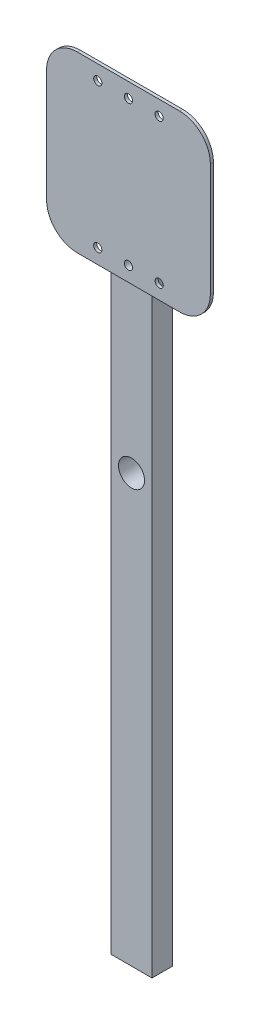
ISO-10303-21;
HEADER;
FILE_DESCRIPTION(('STEP AP214'),'2;1');
FILE_NAME('part.step','',(''),(''),'','','');
FILE_SCHEMA(('AUTOMOTIVE_DESIGN { 1 0 10303 214 1 1 1 1 }'));
ENDSEC;
DATA;
#1=APPLICATION_CONTEXT('core data for automotive mechanical design processes');
#2=APPLICATION_PROTOCOL_DEFINITION('international standard','automotive_design',2000,#1);
#3=PRODUCT_CONTEXT('',#1,'mechanical');
#4=PRODUCT('Part','Part','',(#3));
#5=PRODUCT_RELATED_PRODUCT_CATEGORY('part','',(#4));
#6=PRODUCT_DEFINITION_FORMATION('','',#4);
#7=PRODUCT_DEFINITION_CONTEXT('part definition',#1,'design');
#8=PRODUCT_DEFINITION('design','',#6,#7);
#9=PRODUCT_DEFINITION_SHAPE('','',#8);
#10=(LENGTH_UNIT() NAMED_UNIT(*) SI_UNIT(.MILLI.,.METRE.));
#11=(NAMED_UNIT(*) PLANE_ANGLE_UNIT() SI_UNIT($,.RADIAN.));
#12=(NAMED_UNIT(*) SI_UNIT($,.STERADIAN.) SOLID_ANGLE_UNIT());
#13=UNCERTAINTY_MEASURE_WITH_UNIT(LENGTH_MEASURE(1.E-05),#10,'distance_accuracy_value','');
#14=(GEOMETRIC_REPRESENTATION_CONTEXT(3) GLOBAL_UNCERTAINTY_ASSIGNED_CONTEXT((#13)) GLOBAL_UNIT_ASSIGNED_CONTEXT((#10,
#11,#12)) REPRESENTATION_CONTEXT('',''));
#15=CARTESIAN_POINT('',(0.,0.,0.));
#16=DIRECTION('',(0.,0.,1.));
#17=DIRECTION('',(1.,0.,0.));
#18=AXIS2_PLACEMENT_3D('',#15,#16,#17);
#19=CARTESIAN_POINT('',(-50.,-55.0000000000001,3.));
#20=DIRECTION('',(0.,0.,1.));
#21=DIRECTION('',(1.,0.,0.));
#22=AXIS2_PLACEMENT_3D('',#19,#20,#21);
#23=PLANE('',#22);
#24=CARTESIAN_POINT('',(-30.,-70.6,3.));
#25=DIRECTION('',(0.,0.,1.));
#26=DIRECTION('',(1.,0.,0.));
#27=AXIS2_PLACEMENT_3D('',#24,#25,#26);
#28=CIRCLE('',#27,4.);
#29=CARTESIAN_POINT('',(-26.,-70.6,3.));
#30=VERTEX_POINT('',#29);
#31=EDGE_CURVE('E226',#30,#30,#28,.T.);
#32=ORIENTED_EDGE('',*,*,#31,.F.);
#33=EDGE_LOOP('',(#32));
#34=FACE_BOUND('',#33,.T.);
#35=CARTESIAN_POINT('',(-30.,70.6,3.));
#36=DIRECTION('',(0.,0.,1.));
#37=DIRECTION('',(1.,0.,0.));
#38=AXIS2_PLACEMENT_3D('',#35,#36,#37);
#39=CIRCLE('',#38,4.);
#40=CARTESIAN_POINT('',(-26.,70.6,3.));
#41=VERTEX_POINT('',#40);
#42=EDGE_CURVE('E238',#41,#41,#39,.T.);
#43=ORIENTED_EDGE('',*,*,#42,.F.);
#44=EDGE_LOOP('',(#43));
#45=FACE_BOUND('',#44,.T.);
#46=CARTESIAN_POINT('',(0.,70.6,3.));
#47=DIRECTION('',(0.,0.,1.));
#48=DIRECTION('',(1.,0.,0.));
#49=AXIS2_PLACEMENT_3D('',#46,#47,#48);
#50=CIRCLE('',#49,4.);
#51=CARTESIAN_POINT('',(4.,70.6,3.));
#52=VERTEX_POINT('',#51);
#53=EDGE_CURVE('E150',#52,#52,#50,.T.);
#54=ORIENTED_EDGE('',*,*,#53,.F.);
#55=EDGE_LOOP('',(#54));
#56=FACE_BOUND('',#55,.T.);
#57=CARTESIAN_POINT('',(-50.,-55.0000000000001,3.));
#58=DIRECTION('',(0.,0.,1.));
#59=DIRECTION('',(1.,0.,0.));
#60=AXIS2_PLACEMENT_3D('',#57,#58,#59);
#61=CIRCLE('',#60,30.);
#62=CARTESIAN_POINT('',(-80.,-54.9999999999999,3.));
#63=VERTEX_POINT('',#62);
#64=CARTESIAN_POINT('',(-49.9999999999999,-85.0000000000001,3.));
#65=VERTEX_POINT('',#64);
#66=EDGE_CURVE('E165',#63,#65,#61,.T.);
#67=ORIENTED_EDGE('',*,*,#66,.T.);
#68=DIRECTION('',(1.,0.,0.));
#69=VECTOR('',#68,1.);
#70=CARTESIAN_POINT('',(49.9999999999994,-85.0000000000003,3.));
#71=LINE('',#70,#69);
#72=CARTESIAN_POINT('',(49.9999999999994,-85.0000000000003,3.));
#73=VERTEX_POINT('',#72);
#74=EDGE_CURVE('E103',#65,#73,#71,.T.);
#75=ORIENTED_EDGE('',*,*,#74,.T.);
#76=CARTESIAN_POINT('',(49.9999999999997,-55.0000000000003,3.));
#77=DIRECTION('',(0.,0.,1.));
#78=DIRECTION('',(1.,0.,0.));
#79=AXIS2_PLACEMENT_3D('',#76,#77,#78);
#80=CIRCLE('',#79,30.);
#81=CARTESIAN_POINT('',(79.9999999999997,-55.0000000000001,3.));
#82=VERTEX_POINT('',#81);
#83=EDGE_CURVE('E253',#73,#82,#80,.T.);
#84=ORIENTED_EDGE('',*,*,#83,.T.);
#85=DIRECTION('',(0.,1.,0.));
#86=VECTOR('',#85,1.);
#87=CARTESIAN_POINT('',(79.9999999999999,54.9999999999997,3.));
#88=LINE('',#87,#86);
#89=CARTESIAN_POINT('',(79.9999999999999,54.9999999999997,3.));
#90=VERTEX_POINT('',#89);
#91=EDGE_CURVE('E255',#82,#90,#88,.T.);
#92=ORIENTED_EDGE('',*,*,#91,.T.);
#93=CARTESIAN_POINT('',(49.9999999999999,55.,3.));
#94=DIRECTION('',(0.,0.,1.));
#95=DIRECTION('',(1.,0.,0.));
#96=AXIS2_PLACEMENT_3D('',#93,#94,#95);
#97=CIRCLE('',#96,30.);
#98=CARTESIAN_POINT('',(49.9999999999997,85.,3.));
#99=VERTEX_POINT('',#98);
#100=EDGE_CURVE('E125',#90,#99,#97,.T.);
#101=ORIENTED_EDGE('',*,*,#100,.T.);
#102=DIRECTION('',(-1.,0.,0.));
#103=VECTOR('',#102,1.);
#104=CARTESIAN_POINT('',(-49.9999999999999,84.9999999999999,3.));
#105=LINE('',#104,#103);
#106=CARTESIAN_POINT('',(-49.9999999999999,84.9999999999999,3.));
#107=VERTEX_POINT('',#106);
#108=EDGE_CURVE('E118',#99,#107,#105,.T.);
#109=ORIENTED_EDGE('',*,*,#108,.T.);
#110=CARTESIAN_POINT('',(-50.0000000000001,54.9999999999999,3.));
#111=DIRECTION('',(0.,0.,1.));
#112=DIRECTION('',(-1.,0.,0.));
#113=AXIS2_PLACEMENT_3D('',#110,#111,#112);
#114=CIRCLE('',#113,30.);
#115=CARTESIAN_POINT('',(-80.0000000000001,54.9999999999997,3.));
#116=VERTEX_POINT('',#115);
#117=EDGE_CURVE('E122',#107,#116,#114,.T.);
#118=ORIENTED_EDGE('',*,*,#117,.T.);
#119=DIRECTION('',(0.,-1.,0.));
#120=VECTOR('',#119,1.);
#121=CARTESIAN_POINT('',(-80.0000000000001,54.9999999999997,3.));
#122=LINE('',#121,#120);
#123=EDGE_CURVE('E61',#116,#63,#122,.T.);
#124=ORIENTED_EDGE('',*,*,#123,.T.);
#125=EDGE_LOOP('',(#67,#75,#84,#92,#101,#109,#118,#124));
#126=FACE_BOUND('',#125,.T.);
#127=CARTESIAN_POINT('',(0.,-70.6,3.));
#128=DIRECTION('',(0.,0.,1.));
#129=DIRECTION('',(1.,0.,0.));
#130=AXIS2_PLACEMENT_3D('',#127,#128,#129);
#131=CIRCLE('',#130,4.);
#132=CARTESIAN_POINT('',(4.,-70.6,3.));
#133=VERTEX_POINT('',#132);
#134=EDGE_CURVE('E241',#133,#133,#131,.T.);
#135=ORIENTED_EDGE('',*,*,#134,.F.);
#136=EDGE_LOOP('',(#135));
#137=FACE_BOUND('',#136,.T.);
#138=CARTESIAN_POINT('',(30.,70.6,3.));
#139=DIRECTION('',(0.,0.,1.));
#140=DIRECTION('',(1.,0.,0.));
#141=AXIS2_PLACEMENT_3D('',#138,#139,#140);
#142=CIRCLE('',#141,4.);
#143=CARTESIAN_POINT('',(34.,70.6,3.));
#144=VERTEX_POINT('',#143);
#145=EDGE_CURVE('E232',#144,#144,#142,.T.);
#146=ORIENTED_EDGE('',*,*,#145,.F.);
#147=EDGE_LOOP('',(#146));
#148=FACE_BOUND('',#147,.T.);
#149=CARTESIAN_POINT('',(30.,-70.6,3.));
#150=DIRECTION('',(0.,0.,1.));
#151=DIRECTION('',(1.,0.,0.));
#152=AXIS2_PLACEMENT_3D('',#149,#150,#151);
#153=CIRCLE('',#152,4.);
#154=CARTESIAN_POINT('',(34.,-70.6,3.));
#155=VERTEX_POINT('',#154);
#156=EDGE_CURVE('E220',#155,#155,#153,.T.);
#157=ORIENTED_EDGE('',*,*,#156,.F.);
#158=EDGE_LOOP('',(#157));
#159=FACE_BOUND('',#158,.T.);
#160=ADVANCED_FACE('F35',(#34,#45,#56,#126,#137,#148,#159),#23,.T.);
#161=CARTESIAN_POINT('',(-50.,-55.0000000000001,0.));
#162=DIRECTION('',(0.,0.,1.));
#163=DIRECTION('',(1.,0.,0.));
#164=AXIS2_PLACEMENT_3D('',#161,#162,#163);
#165=PLANE('',#164);
#166=DIRECTION('',(-1.,0.,0.));
#167=VECTOR('',#166,1.);
#168=CARTESIAN_POINT('',(-20.,0.,0.));
#169=LINE('',#168,#167);
#170=CARTESIAN_POINT('',(20.,0.,0.));
#171=VERTEX_POINT('',#170);
#172=CARTESIAN_POINT('',(-20.,0.,0.));
#173=VERTEX_POINT('',#172);
#174=EDGE_CURVE('E191',#171,#173,#169,.T.);
#175=ORIENTED_EDGE('',*,*,#174,.T.);
#176=DIRECTION('',(0.,-1.,0.));
#177=VECTOR('',#176,1.);
#178=CARTESIAN_POINT('',(-20.,0.,0.));
#179=LINE('',#178,#177);
#180=CARTESIAN_POINT('',(-20.,-85.0000000000002,0.));
#181=VERTEX_POINT('',#180);
#182=EDGE_CURVE('E52',#173,#181,#179,.T.);
#183=ORIENTED_EDGE('',*,*,#182,.T.);
#184=DIRECTION('',(1.,0.,0.));
#185=VECTOR('',#184,1.);
#186=CARTESIAN_POINT('',(49.9999999999994,-85.0000000000003,0.));
#187=LINE('',#186,#185);
#188=CARTESIAN_POINT('',(-49.9999999999999,-85.0000000000001,0.));
#189=VERTEX_POINT('',#188);
#190=EDGE_CURVE('E151',#189,#181,#187,.T.);
#191=ORIENTED_EDGE('',*,*,#190,.F.);
#192=CARTESIAN_POINT('',(-50.,-55.0000000000001,0.));
#193=DIRECTION('',(0.,0.,1.));
#194=DIRECTION('',(1.,0.,0.));
#195=AXIS2_PLACEMENT_3D('',#192,#193,#194);
#196=CIRCLE('',#195,30.);
#197=CARTESIAN_POINT('',(-80.,-54.9999999999999,0.));
#198=VERTEX_POINT('',#197);
#199=EDGE_CURVE('E146',#198,#189,#196,.T.);
#200=ORIENTED_EDGE('',*,*,#199,.F.);
#201=DIRECTION('',(0.,-1.,0.));
#202=VECTOR('',#201,1.);
#203=CARTESIAN_POINT('',(-80.0000000000001,54.9999999999997,0.));
#204=LINE('',#203,#202);
#205=CARTESIAN_POINT('',(-80.0000000000001,54.9999999999997,0.));
#206=VERTEX_POINT('',#205);
#207=EDGE_CURVE('E94',#206,#198,#204,.T.);
#208=ORIENTED_EDGE('',*,*,#207,.F.);
#209=CARTESIAN_POINT('',(-50.0000000000001,54.9999999999999,0.));
#210=DIRECTION('',(0.,0.,1.));
#211=DIRECTION('',(-1.,0.,0.));
#212=AXIS2_PLACEMENT_3D('',#209,#210,#211);
#213=CIRCLE('',#212,30.);
#214=CARTESIAN_POINT('',(-49.9999999999999,84.9999999999999,0.));
#215=VERTEX_POINT('',#214);
#216=EDGE_CURVE('E162',#215,#206,#213,.T.);
#217=ORIENTED_EDGE('',*,*,#216,.F.);
#218=DIRECTION('',(-1.,0.,0.));
#219=VECTOR('',#218,1.);
#220=CARTESIAN_POINT('',(-49.9999999999999,84.9999999999999,0.));
#221=LINE('',#220,#219);
#222=CARTESIAN_POINT('',(49.9999999999997,85.,0.));
#223=VERTEX_POINT('',#222);
#224=EDGE_CURVE('E134',#223,#215,#221,.T.);
#225=ORIENTED_EDGE('',*,*,#224,.F.);
#226=CARTESIAN_POINT('',(49.9999999999999,55.,0.));
#227=DIRECTION('',(0.,0.,1.));
#228=DIRECTION('',(1.,0.,0.));
#229=AXIS2_PLACEMENT_3D('',#226,#227,#228);
#230=CIRCLE('',#229,30.);
#231=CARTESIAN_POINT('',(79.9999999999999,54.9999999999997,0.));
#232=VERTEX_POINT('',#231);
#233=EDGE_CURVE('E159',#232,#223,#230,.T.);
#234=ORIENTED_EDGE('',*,*,#233,.F.);
#235=DIRECTION('',(0.,1.,0.));
#236=VECTOR('',#235,1.);
#237=CARTESIAN_POINT('',(79.9999999999999,54.9999999999997,0.));
#238=LINE('',#237,#236);
#239=CARTESIAN_POINT('',(79.9999999999997,-55.0000000000001,0.));
#240=VERTEX_POINT('',#239);
#241=EDGE_CURVE('E157',#240,#232,#238,.T.);
#242=ORIENTED_EDGE('',*,*,#241,.F.);
#243=CARTESIAN_POINT('',(49.9999999999997,-55.0000000000003,0.));
#244=DIRECTION('',(0.,0.,1.));
#245=DIRECTION('',(1.,0.,0.));
#246=AXIS2_PLACEMENT_3D('',#243,#244,#245);
#247=CIRCLE('',#246,30.);
#248=CARTESIAN_POINT('',(49.9999999999994,-85.0000000000003,0.));
#249=VERTEX_POINT('',#248);
#250=EDGE_CURVE('E154',#249,#240,#247,.T.);
#251=ORIENTED_EDGE('',*,*,#250,.F.);
#252=CARTESIAN_POINT('',(20.,-85.0000000000002,0.));
#253=VERTEX_POINT('',#252);
#254=EDGE_CURVE('E149',#253,#249,#187,.T.);
#255=ORIENTED_EDGE('',*,*,#254,.F.);
#256=DIRECTION('',(0.,1.,0.));
#257=VECTOR('',#256,1.);
#258=CARTESIAN_POINT('',(20.,0.,0.));
#259=LINE('',#258,#257);
#260=EDGE_CURVE('E11',#253,#171,#259,.T.);
#261=ORIENTED_EDGE('',*,*,#260,.T.);
#262=EDGE_LOOP('',(#175,#183,#191,#200,#208,#217,#225,#234,#242,#251,#255,#261));
#263=FACE_BOUND('',#262,.T.);
#264=CARTESIAN_POINT('',(0.,70.6,0.));
#265=DIRECTION('',(0.,0.,1.));
#266=DIRECTION('',(1.,0.,0.));
#267=AXIS2_PLACEMENT_3D('',#264,#265,#266);
#268=CIRCLE('',#267,4.);
#269=CARTESIAN_POINT('',(4.,70.6,0.));
#270=VERTEX_POINT('',#269);
#271=EDGE_CURVE('E246',#270,#270,#268,.T.);
#272=ORIENTED_EDGE('',*,*,#271,.T.);
#273=EDGE_LOOP('',(#272));
#274=FACE_BOUND('',#273,.T.);
#275=CARTESIAN_POINT('',(-30.,70.6,0.));
#276=DIRECTION('',(0.,0.,1.));
#277=DIRECTION('',(1.,0.,0.));
#278=AXIS2_PLACEMENT_3D('',#275,#276,#277);
#279=CIRCLE('',#278,4.);
#280=CARTESIAN_POINT('',(-26.,70.6,0.));
#281=VERTEX_POINT('',#280);
#282=EDGE_CURVE('E235',#281,#281,#279,.T.);
#283=ORIENTED_EDGE('',*,*,#282,.T.);
#284=EDGE_LOOP('',(#283));
#285=FACE_BOUND('',#284,.T.);
#286=CARTESIAN_POINT('',(30.,70.6,0.));
#287=DIRECTION('',(0.,0.,1.));
#288=DIRECTION('',(1.,0.,0.));
#289=AXIS2_PLACEMENT_3D('',#286,#287,#288);
#290=CIRCLE('',#289,4.);
#291=CARTESIAN_POINT('',(34.,70.6,0.));
#292=VERTEX_POINT('',#291);
#293=EDGE_CURVE('E229',#292,#292,#290,.T.);
#294=ORIENTED_EDGE('',*,*,#293,.T.);
#295=EDGE_LOOP('',(#294));
#296=FACE_BOUND('',#295,.T.);
#297=CARTESIAN_POINT('',(-30.,-70.6,0.));
#298=DIRECTION('',(0.,0.,1.));
#299=DIRECTION('',(1.,0.,0.));
#300=AXIS2_PLACEMENT_3D('',#297,#298,#299);
#301=CIRCLE('',#300,4.);
#302=CARTESIAN_POINT('',(-26.,-70.6,0.));
#303=VERTEX_POINT('',#302);
#304=EDGE_CURVE('E223',#303,#303,#301,.T.);
#305=ORIENTED_EDGE('',*,*,#304,.T.);
#306=EDGE_LOOP('',(#305));
#307=FACE_BOUND('',#306,.T.);
#308=CARTESIAN_POINT('',(30.,-70.6,0.));
#309=DIRECTION('',(0.,0.,1.));
#310=DIRECTION('',(1.,0.,0.));
#311=AXIS2_PLACEMENT_3D('',#308,#309,#310);
#312=CIRCLE('',#311,4.);
#313=CARTESIAN_POINT('',(34.,-70.6,0.));
#314=VERTEX_POINT('',#313);
#315=EDGE_CURVE('E210',#314,#314,#312,.T.);
#316=ORIENTED_EDGE('',*,*,#315,.T.);
#317=EDGE_LOOP('',(#316));
#318=FACE_BOUND('',#317,.T.);
#319=ADVANCED_FACE('F188',(#263,#274,#285,#296,#307,#318),#165,.F.);
#320=CARTESIAN_POINT('',(-50.,-55.0000000000001,3.));
#321=DIRECTION('',(0.,0.,-1.));
#322=DIRECTION('',(-1.,0.,0.));
#323=AXIS2_PLACEMENT_3D('',#320,#321,#322);
#324=CYLINDRICAL_SURFACE('',#323,30.);
#325=ORIENTED_EDGE('',*,*,#199,.T.);
#326=DIRECTION('',(0.,0.,-1.));
#327=VECTOR('',#326,1.);
#328=CARTESIAN_POINT('',(-49.9999999999999,-85.0000000000001,3.));
#329=LINE('',#328,#327);
#330=EDGE_CURVE('E39',#65,#189,#329,.T.);
#331=ORIENTED_EDGE('',*,*,#330,.F.);
#332=ORIENTED_EDGE('',*,*,#66,.F.);
#333=DIRECTION('',(0.,0.,-1.));
#334=VECTOR('',#333,1.);
#335=CARTESIAN_POINT('',(-80.,-54.9999999999999,3.));
#336=LINE('',#335,#334);
#337=EDGE_CURVE('E142',#63,#198,#336,.T.);
#338=ORIENTED_EDGE('',*,*,#337,.T.);
#339=EDGE_LOOP('',(#325,#331,#332,#338));
#340=FACE_BOUND('',#339,.T.);
#341=ADVANCED_FACE('F37',(#340),#324,.T.);
#342=CARTESIAN_POINT('',(49.9999999999994,-85.0000000000003,3.));
#343=DIRECTION('',(0.,1.,0.));
#344=DIRECTION('',(-1.,0.,0.));
#345=AXIS2_PLACEMENT_3D('',#342,#343,#344);
#346=PLANE('',#345);
#347=ORIENTED_EDGE('',*,*,#190,.T.);
#348=EDGE_CURVE('E155',#181,#253,#187,.T.);
#349=ORIENTED_EDGE('',*,*,#348,.T.);
#350=ORIENTED_EDGE('',*,*,#254,.T.);
#351=DIRECTION('',(0.,0.,-1.));
#352=VECTOR('',#351,1.);
#353=CARTESIAN_POINT('',(49.9999999999994,-85.0000000000003,3.));
#354=LINE('',#353,#352);
#355=EDGE_CURVE('E174',#73,#249,#354,.T.);
#356=ORIENTED_EDGE('',*,*,#355,.F.);
#357=ORIENTED_EDGE('',*,*,#74,.F.);
#358=ORIENTED_EDGE('',*,*,#330,.T.);
#359=EDGE_LOOP('',(#347,#349,#350,#356,#357,#358));
#360=FACE_BOUND('',#359,.T.);
#361=ADVANCED_FACE('F180',(#360),#346,.F.);
#362=CARTESIAN_POINT('',(49.9999999999997,-55.0000000000003,3.));
#363=DIRECTION('',(0.,0.,-1.));
#364=DIRECTION('',(-1.,0.,0.));
#365=AXIS2_PLACEMENT_3D('',#362,#363,#364);
#366=CYLINDRICAL_SURFACE('',#365,30.);
#367=ORIENTED_EDGE('',*,*,#250,.T.);
#368=DIRECTION('',(0.,0.,-1.));
#369=VECTOR('',#368,1.);
#370=CARTESIAN_POINT('',(79.9999999999997,-55.0000000000001,3.));
#371=LINE('',#370,#369);
#372=EDGE_CURVE('E172',#82,#240,#371,.T.);
#373=ORIENTED_EDGE('',*,*,#372,.F.);
#374=ORIENTED_EDGE('',*,*,#83,.F.);
#375=ORIENTED_EDGE('',*,*,#355,.T.);
#376=EDGE_LOOP('',(#367,#373,#374,#375));
#377=FACE_BOUND('',#376,.T.);
#378=ADVANCED_FACE('F267',(#377),#366,.T.);
#379=CARTESIAN_POINT('',(79.9999999999999,54.9999999999997,3.));
#380=DIRECTION('',(-1.,0.,0.));
#381=DIRECTION('',(0.,-1.,0.));
#382=AXIS2_PLACEMENT_3D('',#379,#380,#381);
#383=PLANE('',#382);
#384=ORIENTED_EDGE('',*,*,#241,.T.);
#385=DIRECTION('',(0.,0.,-1.));
#386=VECTOR('',#385,1.);
#387=CARTESIAN_POINT('',(79.9999999999999,54.9999999999997,3.));
#388=LINE('',#387,#386);
#389=EDGE_CURVE('E169',#90,#232,#388,.T.);
#390=ORIENTED_EDGE('',*,*,#389,.F.);
#391=ORIENTED_EDGE('',*,*,#91,.F.);
#392=ORIENTED_EDGE('',*,*,#372,.T.);
#393=EDGE_LOOP('',(#384,#390,#391,#392));
#394=FACE_BOUND('',#393,.T.);
#395=ADVANCED_FACE('F260',(#394),#383,.F.);
#396=CARTESIAN_POINT('',(49.9999999999999,55.,3.));
#397=DIRECTION('',(0.,0.,-1.));
#398=DIRECTION('',(-1.,0.,0.));
#399=AXIS2_PLACEMENT_3D('',#396,#397,#398);
#400=CYLINDRICAL_SURFACE('',#399,30.);
#401=ORIENTED_EDGE('',*,*,#233,.T.);
#402=DIRECTION('',(0.,0.,-1.));
#403=VECTOR('',#402,1.);
#404=CARTESIAN_POINT('',(49.9999999999997,85.,3.));
#405=LINE('',#404,#403);
#406=EDGE_CURVE('E137',#99,#223,#405,.T.);
#407=ORIENTED_EDGE('',*,*,#406,.F.);
#408=ORIENTED_EDGE('',*,*,#100,.F.);
#409=ORIENTED_EDGE('',*,*,#389,.T.);
#410=EDGE_LOOP('',(#401,#407,#408,#409));
#411=FACE_BOUND('',#410,.T.);
#412=ADVANCED_FACE('F264',(#411),#400,.T.);
#413=CARTESIAN_POINT('',(-49.9999999999999,84.9999999999999,3.));
#414=DIRECTION('',(0.,-1.,0.));
#415=DIRECTION('',(1.,0.,0.));
#416=AXIS2_PLACEMENT_3D('',#413,#414,#415);
#417=PLANE('',#416);
#418=ORIENTED_EDGE('',*,*,#224,.T.);
#419=DIRECTION('',(0.,0.,-1.));
#420=VECTOR('',#419,1.);
#421=CARTESIAN_POINT('',(-49.9999999999999,84.9999999999999,3.));
#422=LINE('',#421,#420);
#423=EDGE_CURVE('E131',#107,#215,#422,.T.);
#424=ORIENTED_EDGE('',*,*,#423,.F.);
#425=ORIENTED_EDGE('',*,*,#108,.F.);
#426=ORIENTED_EDGE('',*,*,#406,.T.);
#427=EDGE_LOOP('',(#418,#424,#425,#426));
#428=FACE_BOUND('',#427,.T.);
#429=ADVANCED_FACE('F132',(#428),#417,.F.);
#430=CARTESIAN_POINT('',(-50.0000000000001,54.9999999999999,3.));
#431=DIRECTION('',(0.,0.,-1.));
#432=DIRECTION('',(-1.,0.,0.));
#433=AXIS2_PLACEMENT_3D('',#430,#431,#432);
#434=CYLINDRICAL_SURFACE('',#433,30.);
#435=ORIENTED_EDGE('',*,*,#216,.T.);
#436=DIRECTION('',(0.,0.,-1.));
#437=VECTOR('',#436,1.);
#438=CARTESIAN_POINT('',(-80.0000000000001,54.9999999999997,3.));
#439=LINE('',#438,#437);
#440=EDGE_CURVE('E138',#116,#206,#439,.T.);
#441=ORIENTED_EDGE('',*,*,#440,.F.);
#442=ORIENTED_EDGE('',*,*,#117,.F.);
#443=ORIENTED_EDGE('',*,*,#423,.T.);
#444=EDGE_LOOP('',(#435,#441,#442,#443));
#445=FACE_BOUND('',#444,.T.);
#446=ADVANCED_FACE('F140',(#445),#434,.T.);
#447=CARTESIAN_POINT('',(-80.0000000000001,54.9999999999997,3.));
#448=DIRECTION('',(1.,0.,0.));
#449=DIRECTION('',(0.,1.,0.));
#450=AXIS2_PLACEMENT_3D('',#447,#448,#449);
#451=PLANE('',#450);
#452=ORIENTED_EDGE('',*,*,#207,.T.);
#453=ORIENTED_EDGE('',*,*,#337,.F.);
#454=ORIENTED_EDGE('',*,*,#123,.F.);
#455=ORIENTED_EDGE('',*,*,#440,.T.);
#456=EDGE_LOOP('',(#452,#453,#454,#455));
#457=FACE_BOUND('',#456,.T.);
#458=ADVANCED_FACE('F265',(#457),#451,.F.);
#459=CARTESIAN_POINT('',(0.,70.6,3.));
#460=DIRECTION('',(0.,0.,-1.));
#461=DIRECTION('',(-1.,0.,0.));
#462=AXIS2_PLACEMENT_3D('',#459,#460,#461);
#463=CYLINDRICAL_SURFACE('',#462,4.);
#464=ORIENTED_EDGE('',*,*,#53,.T.);
#465=EDGE_LOOP('',(#464));
#466=FACE_BOUND('',#465,.T.);
#467=ORIENTED_EDGE('',*,*,#271,.F.);
#468=EDGE_LOOP('',(#467));
#469=FACE_BOUND('',#468,.T.);
#470=ADVANCED_FACE('F350',(#466,#469),#463,.F.);
#471=CARTESIAN_POINT('',(0.,-70.6,3.));
#472=DIRECTION('',(0.,0.,-1.));
#473=DIRECTION('',(-1.,0.,0.));
#474=AXIS2_PLACEMENT_3D('',#471,#472,#473);
#475=CYLINDRICAL_SURFACE('',#474,4.);
#476=ORIENTED_EDGE('',*,*,#134,.T.);
#477=EDGE_LOOP('',(#476));
#478=FACE_BOUND('',#477,.T.);
#479=CARTESIAN_POINT('',(0.,-70.6,-20.));
#480=DIRECTION('',(0.,0.,1.));
#481=DIRECTION('',(1.,0.,0.));
#482=AXIS2_PLACEMENT_3D('',#479,#480,#481);
#483=CIRCLE('',#482,4.);
#484=CARTESIAN_POINT('',(4.,-70.6,-20.));
#485=VERTEX_POINT('',#484);
#486=EDGE_CURVE('E312',#485,#485,#483,.F.);
#487=ORIENTED_EDGE('',*,*,#486,.T.);
#488=EDGE_LOOP('',(#487));
#489=FACE_BOUND('',#488,.T.);
#490=ADVANCED_FACE('F318',(#478,#489),#475,.F.);
#491=CARTESIAN_POINT('',(-30.,70.6,3.));
#492=DIRECTION('',(0.,0.,-1.));
#493=DIRECTION('',(-1.,0.,0.));
#494=AXIS2_PLACEMENT_3D('',#491,#492,#493);
#495=CYLINDRICAL_SURFACE('',#494,4.);
#496=ORIENTED_EDGE('',*,*,#42,.T.);
#497=EDGE_LOOP('',(#496));
#498=FACE_BOUND('',#497,.T.);
#499=ORIENTED_EDGE('',*,*,#282,.F.);
#500=EDGE_LOOP('',(#499));
#501=FACE_BOUND('',#500,.T.);
#502=ADVANCED_FACE('F443',(#498,#501),#495,.F.);
#503=CARTESIAN_POINT('',(30.,70.6,3.));
#504=DIRECTION('',(0.,0.,-1.));
#505=DIRECTION('',(-1.,0.,0.));
#506=AXIS2_PLACEMENT_3D('',#503,#504,#505);
#507=CYLINDRICAL_SURFACE('',#506,4.);
#508=ORIENTED_EDGE('',*,*,#145,.T.);
#509=EDGE_LOOP('',(#508));
#510=FACE_BOUND('',#509,.T.);
#511=ORIENTED_EDGE('',*,*,#293,.F.);
#512=EDGE_LOOP('',(#511));
#513=FACE_BOUND('',#512,.T.);
#514=ADVANCED_FACE('F467',(#510,#513),#507,.F.);
#515=CARTESIAN_POINT('',(-30.,-70.6,3.));
#516=DIRECTION('',(0.,0.,-1.));
#517=DIRECTION('',(-1.,0.,0.));
#518=AXIS2_PLACEMENT_3D('',#515,#516,#517);
#519=CYLINDRICAL_SURFACE('',#518,4.);
#520=ORIENTED_EDGE('',*,*,#31,.T.);
#521=EDGE_LOOP('',(#520));
#522=FACE_BOUND('',#521,.T.);
#523=ORIENTED_EDGE('',*,*,#304,.F.);
#524=EDGE_LOOP('',(#523));
#525=FACE_BOUND('',#524,.T.);
#526=ADVANCED_FACE('F462',(#522,#525),#519,.F.);
#527=CARTESIAN_POINT('',(30.,-70.6,3.));
#528=DIRECTION('',(0.,0.,-1.));
#529=DIRECTION('',(-1.,0.,0.));
#530=AXIS2_PLACEMENT_3D('',#527,#528,#529);
#531=CYLINDRICAL_SURFACE('',#530,4.);
#532=ORIENTED_EDGE('',*,*,#156,.T.);
#533=EDGE_LOOP('',(#532));
#534=FACE_BOUND('',#533,.T.);
#535=ORIENTED_EDGE('',*,*,#315,.F.);
#536=EDGE_LOOP('',(#535));
#537=FACE_BOUND('',#536,.T.);
#538=ADVANCED_FACE('F328',(#534,#537),#531,.F.);
#539=CARTESIAN_POINT('',(0.,-247.75,-20.));
#540=DIRECTION('',(0.,0.,1.));
#541=DIRECTION('',(1.,0.,0.));
#542=AXIS2_PLACEMENT_3D('',#539,#540,#541);
#543=CYLINDRICAL_SURFACE('',#542,12.7);
#544=CARTESIAN_POINT('',(0.,-247.75,-20.));
#545=DIRECTION('',(0.,0.,1.));
#546=DIRECTION('',(1.,0.,0.));
#547=AXIS2_PLACEMENT_3D('',#544,#545,#546);
#548=CIRCLE('',#547,12.7);
#549=CARTESIAN_POINT('',(12.7,-247.75,-20.));
#550=VERTEX_POINT('',#549);
#551=EDGE_CURVE('E200',#550,#550,#548,.T.);
#552=ORIENTED_EDGE('',*,*,#551,.F.);
#553=EDGE_LOOP('',(#552));
#554=FACE_BOUND('',#553,.T.);
#555=CARTESIAN_POINT('',(0.,-247.75,0.));
#556=DIRECTION('',(0.,0.,1.));
#557=DIRECTION('',(1.,0.,0.));
#558=AXIS2_PLACEMENT_3D('',#555,#556,#557);
#559=CIRCLE('',#558,12.7);
#560=CARTESIAN_POINT('',(12.7,-247.75,0.));
#561=VERTEX_POINT('',#560);
#562=EDGE_CURVE('E309',#561,#561,#559,.T.);
#563=ORIENTED_EDGE('',*,*,#562,.T.);
#564=EDGE_LOOP('',(#563));
#565=FACE_BOUND('',#564,.T.);
#566=ADVANCED_FACE('F322',(#554,#565),#543,.F.);
#567=CARTESIAN_POINT('',(0.,0.,-20.));
#568=DIRECTION('',(0.,0.,1.));
#569=DIRECTION('',(1.,0.,0.));
#570=AXIS2_PLACEMENT_3D('',#567,#568,#569);
#571=PLANE('',#570);
#572=ORIENTED_EDGE('',*,*,#486,.F.);
#573=EDGE_LOOP('',(#572));
#574=FACE_BOUND('',#573,.T.);
#575=ORIENTED_EDGE('',*,*,#551,.T.);
#576=EDGE_LOOP('',(#575));
#577=FACE_BOUND('',#576,.T.);
#578=DIRECTION('',(0.,-1.,0.));
#579=VECTOR('',#578,1.);
#580=CARTESIAN_POINT('',(-20.,0.,-20.));
#581=LINE('',#580,#579);
#582=CARTESIAN_POINT('',(-20.,0.,-20.));
#583=VERTEX_POINT('',#582);
#584=CARTESIAN_POINT('',(-20.,-665.,-20.));
#585=VERTEX_POINT('',#584);
#586=EDGE_CURVE('E207',#583,#585,#581,.T.);
#587=ORIENTED_EDGE('',*,*,#586,.F.);
#588=DIRECTION('',(-1.,0.,0.));
#589=VECTOR('',#588,1.);
#590=CARTESIAN_POINT('',(-20.,0.,-20.));
#591=LINE('',#590,#589);
#592=CARTESIAN_POINT('',(20.,0.,-20.));
#593=VERTEX_POINT('',#592);
#594=EDGE_CURVE('E202',#593,#583,#591,.T.);
#595=ORIENTED_EDGE('',*,*,#594,.F.);
#596=DIRECTION('',(0.,1.,0.));
#597=VECTOR('',#596,1.);
#598=CARTESIAN_POINT('',(20.,0.,-20.));
#599=LINE('',#598,#597);
#600=CARTESIAN_POINT('',(20.,-665.,-20.));
#601=VERTEX_POINT('',#600);
#602=EDGE_CURVE('E300',#601,#593,#599,.T.);
#603=ORIENTED_EDGE('',*,*,#602,.F.);
#604=DIRECTION('',(1.,0.,0.));
#605=VECTOR('',#604,1.);
#606=CARTESIAN_POINT('',(-20.,-665.,-20.));
#607=LINE('',#606,#605);
#608=EDGE_CURVE('E304',#585,#601,#607,.T.);
#609=ORIENTED_EDGE('',*,*,#608,.F.);
#610=EDGE_LOOP('',(#587,#595,#603,#609));
#611=FACE_BOUND('',#610,.T.);
#612=ADVANCED_FACE('F303',(#574,#577,#611),#571,.F.);
#613=CARTESIAN_POINT('',(-20.,-665.,-20.));
#614=DIRECTION('',(0.,-1.,0.));
#615=DIRECTION('',(0.,0.,-1.));
#616=AXIS2_PLACEMENT_3D('',#613,#614,#615);
#617=PLANE('',#616);
#618=DIRECTION('',(1.,0.,0.));
#619=VECTOR('',#618,1.);
#620=CARTESIAN_POINT('',(-20.,-665.,0.));
#621=LINE('',#620,#619);
#622=CARTESIAN_POINT('',(-20.,-665.,0.));
#623=VERTEX_POINT('',#622);
#624=CARTESIAN_POINT('',(20.,-665.,0.));
#625=VERTEX_POINT('',#624);
#626=EDGE_CURVE('E194',#623,#625,#621,.T.);
#627=ORIENTED_EDGE('',*,*,#626,.F.);
#628=DIRECTION('',(0.,0.,1.));
#629=VECTOR('',#628,1.);
#630=CARTESIAN_POINT('',(-20.,-665.,-20.));
#631=LINE('',#630,#629);
#632=EDGE_CURVE('E217',#585,#623,#631,.T.);
#633=ORIENTED_EDGE('',*,*,#632,.F.);
#634=ORIENTED_EDGE('',*,*,#608,.T.);
#635=DIRECTION('',(0.,0.,1.));
#636=VECTOR('',#635,1.);
#637=CARTESIAN_POINT('',(20.,-665.,-20.));
#638=LINE('',#637,#636);
#639=EDGE_CURVE('E214',#601,#625,#638,.T.);
#640=ORIENTED_EDGE('',*,*,#639,.T.);
#641=EDGE_LOOP('',(#627,#633,#634,#640));
#642=FACE_BOUND('',#641,.T.);
#643=ADVANCED_FACE('F285',(#642),#617,.T.);
#644=CARTESIAN_POINT('',(20.,0.,-20.));
#645=DIRECTION('',(1.,0.,0.));
#646=DIRECTION('',(0.,0.,-1.));
#647=AXIS2_PLACEMENT_3D('',#644,#645,#646);
#648=PLANE('',#647);
#649=EDGE_CURVE('E45',#625,#253,#259,.T.);
#650=ORIENTED_EDGE('',*,*,#649,.F.);
#651=ORIENTED_EDGE('',*,*,#639,.F.);
#652=ORIENTED_EDGE('',*,*,#602,.T.);
#653=DIRECTION('',(0.,0.,1.));
#654=VECTOR('',#653,1.);
#655=CARTESIAN_POINT('',(20.,0.,-20.));
#656=LINE('',#655,#654);
#657=EDGE_CURVE('E211',#593,#171,#656,.T.);
#658=ORIENTED_EDGE('',*,*,#657,.T.);
#659=ORIENTED_EDGE('',*,*,#260,.F.);
#660=EDGE_LOOP('',(#650,#651,#652,#658,#659));
#661=FACE_BOUND('',#660,.T.);
#662=ADVANCED_FACE('F299',(#661),#648,.T.);
#663=CARTESIAN_POINT('',(-20.,0.,-20.));
#664=DIRECTION('',(0.,1.,0.));
#665=DIRECTION('',(0.,0.,1.));
#666=AXIS2_PLACEMENT_3D('',#663,#664,#665);
#667=PLANE('',#666);
#668=ORIENTED_EDGE('',*,*,#174,.F.);
#669=ORIENTED_EDGE('',*,*,#657,.F.);
#670=ORIENTED_EDGE('',*,*,#594,.T.);
#671=DIRECTION('',(0.,0.,1.));
#672=VECTOR('',#671,1.);
#673=CARTESIAN_POINT('',(-20.,0.,-20.));
#674=LINE('',#673,#672);
#675=EDGE_CURVE('E208',#583,#173,#674,.T.);
#676=ORIENTED_EDGE('',*,*,#675,.T.);
#677=EDGE_LOOP('',(#668,#669,#670,#676));
#678=FACE_BOUND('',#677,.T.);
#679=ADVANCED_FACE('F337',(#678),#667,.T.);
#680=CARTESIAN_POINT('',(-20.,0.,-20.));
#681=DIRECTION('',(-1.,0.,0.));
#682=DIRECTION('',(0.,0.,1.));
#683=AXIS2_PLACEMENT_3D('',#680,#681,#682);
#684=PLANE('',#683);
#685=ORIENTED_EDGE('',*,*,#182,.F.);
#686=ORIENTED_EDGE('',*,*,#675,.F.);
#687=ORIENTED_EDGE('',*,*,#586,.T.);
#688=ORIENTED_EDGE('',*,*,#632,.T.);
#689=EDGE_CURVE('E195',#181,#623,#179,.T.);
#690=ORIENTED_EDGE('',*,*,#689,.F.);
#691=EDGE_LOOP('',(#685,#686,#687,#688,#690));
#692=FACE_BOUND('',#691,.T.);
#693=ADVANCED_FACE('F274',(#692),#684,.T.);
#694=CARTESIAN_POINT('',(0.,0.,0.));
#695=DIRECTION('',(0.,0.,1.));
#696=DIRECTION('',(1.,0.,0.));
#697=AXIS2_PLACEMENT_3D('',#694,#695,#696);
#698=PLANE('',#697);
#699=ORIENTED_EDGE('',*,*,#562,.F.);
#700=EDGE_LOOP('',(#699));
#701=FACE_BOUND('',#700,.T.);
#702=ORIENTED_EDGE('',*,*,#348,.F.);
#703=ORIENTED_EDGE('',*,*,#689,.T.);
#704=ORIENTED_EDGE('',*,*,#626,.T.);
#705=ORIENTED_EDGE('',*,*,#649,.T.);
#706=EDGE_LOOP('',(#702,#703,#704,#705));
#707=FACE_BOUND('',#706,.T.);
#708=ADVANCED_FACE('F271',(#701,#707),#698,.T.);
#709=CLOSED_SHELL('',(#160,#319,#341,#361,#378,#395,#412,#429,#446,#458,#470,#490,#502,#514,
#526,#538,#566,#612,#643,#662,#679,#693,#708));
#710=MANIFOLD_SOLID_BREP('B2',#709);
#711=ADVANCED_BREP_SHAPE_REPRESENTATION('',(#18,#710),#14);
#712=SHAPE_DEFINITION_REPRESENTATION(#9,#711);
ENDSEC;
END-ISO-10303-21;
